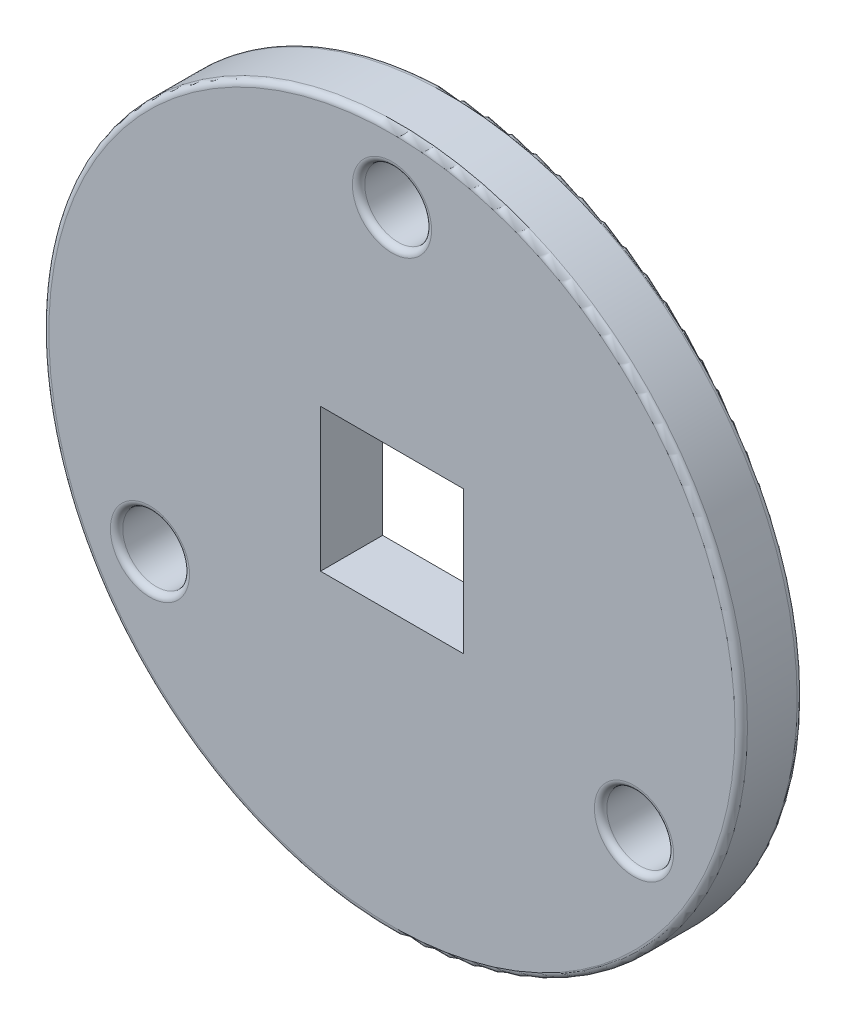
ISO-10303-21;
HEADER;
FILE_DESCRIPTION(('STEP AP214'),'2;1');
FILE_NAME('part.step','',(''),(''),'','','');
FILE_SCHEMA(('AUTOMOTIVE_DESIGN { 1 0 10303 214 1 1 1 1 }'));
ENDSEC;
DATA;
#1=APPLICATION_CONTEXT('core data for automotive mechanical design processes');
#2=APPLICATION_PROTOCOL_DEFINITION('international standard','automotive_design',2000,#1);
#3=PRODUCT_CONTEXT('',#1,'mechanical');
#4=PRODUCT('Part','Part','',(#3));
#5=PRODUCT_RELATED_PRODUCT_CATEGORY('part','',(#4));
#6=PRODUCT_DEFINITION_FORMATION('','',#4);
#7=PRODUCT_DEFINITION_CONTEXT('part definition',#1,'design');
#8=PRODUCT_DEFINITION('design','',#6,#7);
#9=PRODUCT_DEFINITION_SHAPE('','',#8);
#10=(LENGTH_UNIT() NAMED_UNIT(*) SI_UNIT(.MILLI.,.METRE.));
#11=(NAMED_UNIT(*) PLANE_ANGLE_UNIT() SI_UNIT($,.RADIAN.));
#12=(NAMED_UNIT(*) SI_UNIT($,.STERADIAN.) SOLID_ANGLE_UNIT());
#13=UNCERTAINTY_MEASURE_WITH_UNIT(LENGTH_MEASURE(1.E-05),#10,'distance_accuracy_value','');
#14=(GEOMETRIC_REPRESENTATION_CONTEXT(3) GLOBAL_UNCERTAINTY_ASSIGNED_CONTEXT((#13)) GLOBAL_UNIT_ASSIGNED_CONTEXT((#10,
#11,#12)) REPRESENTATION_CONTEXT('',''));
#15=CARTESIAN_POINT('',(0.,0.,0.));
#16=DIRECTION('',(0.,0.,1.));
#17=DIRECTION('',(1.,0.,0.));
#18=AXIS2_PLACEMENT_3D('',#15,#16,#17);
#19=CARTESIAN_POINT('',(0.,0.,20.));
#20=DIRECTION('',(0.,0.,1.));
#21=DIRECTION('',(1.,0.,0.));
#22=AXIS2_PLACEMENT_3D('',#19,#20,#21);
#23=PLANE('',#22);
#24=CARTESIAN_POINT('',(0.,0.,20.));
#25=DIRECTION('',(0.,0.,1.));
#26=DIRECTION('',(1.,0.,0.));
#27=AXIS2_PLACEMENT_3D('',#24,#25,#26);
#28=CIRCLE('',#27,110.5);
#29=CARTESIAN_POINT('',(110.5,0.,20.));
#30=VERTEX_POINT('',#29);
#31=EDGE_CURVE('E156',#30,#30,#28,.T.);
#32=ORIENTED_EDGE('',*,*,#31,.T.);
#33=EDGE_LOOP('',(#32));
#34=FACE_BOUND('',#33,.T.);
#35=CARTESIAN_POINT('',(-77.9422863405995,-45.,20.));
#36=DIRECTION('',(0.,0.,1.));
#37=DIRECTION('',(1.,0.,0.));
#38=AXIS2_PLACEMENT_3D('',#35,#36,#37);
#39=CIRCLE('',#38,12.75);
#40=CARTESIAN_POINT('',(-65.1922863405995,-45.,20.));
#41=VERTEX_POINT('',#40);
#42=EDGE_CURVE('E153',#41,#41,#39,.F.);
#43=ORIENTED_EDGE('',*,*,#42,.T.);
#44=EDGE_LOOP('',(#43));
#45=FACE_BOUND('',#44,.T.);
#46=CARTESIAN_POINT('',(0.,90.,20.));
#47=DIRECTION('',(0.,0.,1.));
#48=DIRECTION('',(1.,0.,0.));
#49=AXIS2_PLACEMENT_3D('',#46,#47,#48);
#50=CIRCLE('',#49,12.75);
#51=CARTESIAN_POINT('',(12.75,90.,20.));
#52=VERTEX_POINT('',#51);
#53=EDGE_CURVE('E150',#52,#52,#50,.F.);
#54=ORIENTED_EDGE('',*,*,#53,.T.);
#55=EDGE_LOOP('',(#54));
#56=FACE_BOUND('',#55,.T.);
#57=CARTESIAN_POINT('',(77.9422863405995,-45.,20.));
#58=DIRECTION('',(0.,0.,1.));
#59=DIRECTION('',(1.,0.,0.));
#60=AXIS2_PLACEMENT_3D('',#57,#58,#59);
#61=CIRCLE('',#60,12.75);
#62=CARTESIAN_POINT('',(90.6922863405995,-45.,20.));
#63=VERTEX_POINT('',#62);
#64=EDGE_CURVE('E147',#63,#63,#61,.F.);
#65=ORIENTED_EDGE('',*,*,#64,.T.);
#66=EDGE_LOOP('',(#65));
#67=FACE_BOUND('',#66,.T.);
#68=DIRECTION('',(1.,0.,0.));
#69=VECTOR('',#68,1.);
#70=CARTESIAN_POINT('',(-23.,-23.,20.));
#71=LINE('',#70,#69);
#72=CARTESIAN_POINT('',(-23.,-23.,20.));
#73=VERTEX_POINT('',#72);
#74=CARTESIAN_POINT('',(23.,-23.,20.));
#75=VERTEX_POINT('',#74);
#76=EDGE_CURVE('E102',#73,#75,#71,.T.);
#77=ORIENTED_EDGE('',*,*,#76,.F.);
#78=DIRECTION('',(0.,-1.,0.));
#79=VECTOR('',#78,1.);
#80=CARTESIAN_POINT('',(-23.,23.,20.));
#81=LINE('',#80,#79);
#82=CARTESIAN_POINT('',(-23.,23.,20.));
#83=VERTEX_POINT('',#82);
#84=EDGE_CURVE('E94',#83,#73,#81,.T.);
#85=ORIENTED_EDGE('',*,*,#84,.F.);
#86=DIRECTION('',(-1.,0.,0.));
#87=VECTOR('',#86,1.);
#88=CARTESIAN_POINT('',(-23.,23.,20.));
#89=LINE('',#88,#87);
#90=CARTESIAN_POINT('',(23.,23.,20.));
#91=VERTEX_POINT('',#90);
#92=EDGE_CURVE('E116',#91,#83,#89,.T.);
#93=ORIENTED_EDGE('',*,*,#92,.F.);
#94=DIRECTION('',(0.,1.,0.));
#95=VECTOR('',#94,1.);
#96=CARTESIAN_POINT('',(23.,23.,20.));
#97=LINE('',#96,#95);
#98=EDGE_CURVE('E114',#75,#91,#97,.T.);
#99=ORIENTED_EDGE('',*,*,#98,.F.);
#100=EDGE_LOOP('',(#77,#85,#93,#99));
#101=FACE_BOUND('',#100,.T.);
#102=ADVANCED_FACE('F53',(#34,#45,#56,#67,#101),#23,.T.);
#103=CARTESIAN_POINT('',(0.,0.,0.));
#104=DIRECTION('',(0.,0.,1.));
#105=DIRECTION('',(1.,0.,0.));
#106=AXIS2_PLACEMENT_3D('',#103,#104,#105);
#107=PLANE('',#106);
#108=CARTESIAN_POINT('',(0.,0.,0.));
#109=DIRECTION('',(0.,0.,1.));
#110=DIRECTION('',(1.,0.,0.));
#111=AXIS2_PLACEMENT_3D('',#108,#109,#110);
#112=CIRCLE('',#111,110.5);
#113=CARTESIAN_POINT('',(110.5,0.,0.));
#114=VERTEX_POINT('',#113);
#115=EDGE_CURVE('E144',#114,#114,#112,.F.);
#116=ORIENTED_EDGE('',*,*,#115,.T.);
#117=EDGE_LOOP('',(#116));
#118=FACE_BOUND('',#117,.T.);
#119=CARTESIAN_POINT('',(77.9422863405995,-45.,0.));
#120=DIRECTION('',(0.,0.,1.));
#121=DIRECTION('',(1.,0.,0.));
#122=AXIS2_PLACEMENT_3D('',#119,#120,#121);
#123=CIRCLE('',#122,12.75);
#124=CARTESIAN_POINT('',(90.6922863405995,-45.,0.));
#125=VERTEX_POINT('',#124);
#126=EDGE_CURVE('E141',#125,#125,#123,.T.);
#127=ORIENTED_EDGE('',*,*,#126,.T.);
#128=EDGE_LOOP('',(#127));
#129=FACE_BOUND('',#128,.T.);
#130=CARTESIAN_POINT('',(0.,90.,0.));
#131=DIRECTION('',(0.,0.,1.));
#132=DIRECTION('',(1.,0.,0.));
#133=AXIS2_PLACEMENT_3D('',#130,#131,#132);
#134=CIRCLE('',#133,12.75);
#135=CARTESIAN_POINT('',(12.75,90.,0.));
#136=VERTEX_POINT('',#135);
#137=EDGE_CURVE('E138',#136,#136,#134,.T.);
#138=ORIENTED_EDGE('',*,*,#137,.T.);
#139=EDGE_LOOP('',(#138));
#140=FACE_BOUND('',#139,.T.);
#141=CARTESIAN_POINT('',(-77.9422863405995,-45.,0.));
#142=DIRECTION('',(0.,0.,1.));
#143=DIRECTION('',(1.,0.,0.));
#144=AXIS2_PLACEMENT_3D('',#141,#142,#143);
#145=CIRCLE('',#144,12.75);
#146=CARTESIAN_POINT('',(-65.1922863405995,-45.,0.));
#147=VERTEX_POINT('',#146);
#148=EDGE_CURVE('E135',#147,#147,#145,.T.);
#149=ORIENTED_EDGE('',*,*,#148,.T.);
#150=EDGE_LOOP('',(#149));
#151=FACE_BOUND('',#150,.T.);
#152=DIRECTION('',(0.,-1.,0.));
#153=VECTOR('',#152,1.);
#154=CARTESIAN_POINT('',(-23.,23.,0.));
#155=LINE('',#154,#153);
#156=CARTESIAN_POINT('',(-23.,23.,0.));
#157=VERTEX_POINT('',#156);
#158=CARTESIAN_POINT('',(-23.,-23.,0.));
#159=VERTEX_POINT('',#158);
#160=EDGE_CURVE('E76',#157,#159,#155,.T.);
#161=ORIENTED_EDGE('',*,*,#160,.T.);
#162=DIRECTION('',(1.,0.,0.));
#163=VECTOR('',#162,1.);
#164=CARTESIAN_POINT('',(-23.,-23.,0.));
#165=LINE('',#164,#163);
#166=CARTESIAN_POINT('',(23.,-23.,0.));
#167=VERTEX_POINT('',#166);
#168=EDGE_CURVE('E109',#159,#167,#165,.T.);
#169=ORIENTED_EDGE('',*,*,#168,.T.);
#170=DIRECTION('',(0.,1.,0.));
#171=VECTOR('',#170,1.);
#172=CARTESIAN_POINT('',(23.,23.,0.));
#173=LINE('',#172,#171);
#174=CARTESIAN_POINT('',(23.,23.,0.));
#175=VERTEX_POINT('',#174);
#176=EDGE_CURVE('E122',#167,#175,#173,.T.);
#177=ORIENTED_EDGE('',*,*,#176,.T.);
#178=DIRECTION('',(-1.,0.,0.));
#179=VECTOR('',#178,1.);
#180=CARTESIAN_POINT('',(-23.,23.,0.));
#181=LINE('',#180,#179);
#182=EDGE_CURVE('E103',#175,#157,#181,.T.);
#183=ORIENTED_EDGE('',*,*,#182,.T.);
#184=EDGE_LOOP('',(#161,#169,#177,#183));
#185=FACE_BOUND('',#184,.T.);
#186=ADVANCED_FACE('F191',(#118,#129,#140,#151,#185),#107,.F.);
#187=CARTESIAN_POINT('',(0.,0.,20.));
#188=DIRECTION('',(0.,0.,-1.));
#189=DIRECTION('',(-1.,0.,0.));
#190=AXIS2_PLACEMENT_3D('',#187,#188,#189);
#191=CYLINDRICAL_SURFACE('',#190,112.5);
#192=CARTESIAN_POINT('',(0.,0.,2.));
#193=DIRECTION('',(0.,0.,1.));
#194=DIRECTION('',(1.,0.,0.));
#195=AXIS2_PLACEMENT_3D('',#192,#193,#194);
#196=CIRCLE('',#195,112.5);
#197=CARTESIAN_POINT('',(112.5,0.,2.));
#198=VERTEX_POINT('',#197);
#199=EDGE_CURVE('E132',#198,#198,#196,.T.);
#200=ORIENTED_EDGE('',*,*,#199,.T.);
#201=EDGE_LOOP('',(#200));
#202=FACE_BOUND('',#201,.T.);
#203=CARTESIAN_POINT('',(0.,0.,18.));
#204=DIRECTION('',(0.,0.,1.));
#205=DIRECTION('',(1.,0.,0.));
#206=AXIS2_PLACEMENT_3D('',#203,#204,#205);
#207=CIRCLE('',#206,112.5);
#208=CARTESIAN_POINT('',(112.5,0.,18.));
#209=VERTEX_POINT('',#208);
#210=EDGE_CURVE('E110',#209,#209,#207,.F.);
#211=ORIENTED_EDGE('',*,*,#210,.T.);
#212=EDGE_LOOP('',(#211));
#213=FACE_BOUND('',#212,.T.);
#214=ADVANCED_FACE('F198',(#202,#213),#191,.T.);
#215=CARTESIAN_POINT('',(-23.,23.,20.));
#216=DIRECTION('',(1.,0.,0.));
#217=DIRECTION('',(0.,0.,-1.));
#218=AXIS2_PLACEMENT_3D('',#215,#216,#217);
#219=PLANE('',#218);
#220=ORIENTED_EDGE('',*,*,#160,.F.);
#221=DIRECTION('',(0.,0.,-1.));
#222=VECTOR('',#221,1.);
#223=CARTESIAN_POINT('',(-23.,23.,20.));
#224=LINE('',#223,#222);
#225=EDGE_CURVE('E98',#83,#157,#224,.T.);
#226=ORIENTED_EDGE('',*,*,#225,.F.);
#227=ORIENTED_EDGE('',*,*,#84,.T.);
#228=DIRECTION('',(0.,0.,-1.));
#229=VECTOR('',#228,1.);
#230=CARTESIAN_POINT('',(-23.,-23.,20.));
#231=LINE('',#230,#229);
#232=EDGE_CURVE('E97',#73,#159,#231,.T.);
#233=ORIENTED_EDGE('',*,*,#232,.T.);
#234=EDGE_LOOP('',(#220,#226,#227,#233));
#235=FACE_BOUND('',#234,.T.);
#236=ADVANCED_FACE('F96',(#235),#219,.T.);
#237=CARTESIAN_POINT('',(-23.,-23.,20.));
#238=DIRECTION('',(0.,1.,0.));
#239=DIRECTION('',(0.,0.,1.));
#240=AXIS2_PLACEMENT_3D('',#237,#238,#239);
#241=PLANE('',#240);
#242=ORIENTED_EDGE('',*,*,#168,.F.);
#243=ORIENTED_EDGE('',*,*,#232,.F.);
#244=ORIENTED_EDGE('',*,*,#76,.T.);
#245=DIRECTION('',(0.,0.,-1.));
#246=VECTOR('',#245,1.);
#247=CARTESIAN_POINT('',(23.,-23.,20.));
#248=LINE('',#247,#246);
#249=EDGE_CURVE('E111',#75,#167,#248,.T.);
#250=ORIENTED_EDGE('',*,*,#249,.T.);
#251=EDGE_LOOP('',(#242,#243,#244,#250));
#252=FACE_BOUND('',#251,.T.);
#253=ADVANCED_FACE('F106',(#252),#241,.T.);
#254=CARTESIAN_POINT('',(23.,23.,20.));
#255=DIRECTION('',(-1.,0.,0.));
#256=DIRECTION('',(0.,0.,1.));
#257=AXIS2_PLACEMENT_3D('',#254,#255,#256);
#258=PLANE('',#257);
#259=ORIENTED_EDGE('',*,*,#176,.F.);
#260=ORIENTED_EDGE('',*,*,#249,.F.);
#261=ORIENTED_EDGE('',*,*,#98,.T.);
#262=DIRECTION('',(0.,0.,-1.));
#263=VECTOR('',#262,1.);
#264=CARTESIAN_POINT('',(23.,23.,20.));
#265=LINE('',#264,#263);
#266=EDGE_CURVE('E68',#91,#175,#265,.T.);
#267=ORIENTED_EDGE('',*,*,#266,.T.);
#268=EDGE_LOOP('',(#259,#260,#261,#267));
#269=FACE_BOUND('',#268,.T.);
#270=ADVANCED_FACE('F234',(#269),#258,.T.);
#271=CARTESIAN_POINT('',(-23.,23.,20.));
#272=DIRECTION('',(0.,-1.,0.));
#273=DIRECTION('',(0.,0.,-1.));
#274=AXIS2_PLACEMENT_3D('',#271,#272,#273);
#275=PLANE('',#274);
#276=ORIENTED_EDGE('',*,*,#182,.F.);
#277=ORIENTED_EDGE('',*,*,#266,.F.);
#278=ORIENTED_EDGE('',*,*,#92,.T.);
#279=ORIENTED_EDGE('',*,*,#225,.T.);
#280=EDGE_LOOP('',(#276,#277,#278,#279));
#281=FACE_BOUND('',#280,.T.);
#282=ADVANCED_FACE('F232',(#281),#275,.T.);
#283=CARTESIAN_POINT('',(0.,90.,20.));
#284=DIRECTION('',(0.,0.,-1.));
#285=DIRECTION('',(-1.,0.,0.));
#286=AXIS2_PLACEMENT_3D('',#283,#284,#285);
#287=CYLINDRICAL_SURFACE('',#286,10.75);
#288=CARTESIAN_POINT('',(0.,90.,2.));
#289=DIRECTION('',(0.,0.,1.));
#290=DIRECTION('',(1.,0.,0.));
#291=AXIS2_PLACEMENT_3D('',#288,#289,#290);
#292=CIRCLE('',#291,10.75);
#293=CARTESIAN_POINT('',(10.75,90.,2.));
#294=VERTEX_POINT('',#293);
#295=EDGE_CURVE('E168',#294,#294,#292,.F.);
#296=ORIENTED_EDGE('',*,*,#295,.T.);
#297=EDGE_LOOP('',(#296));
#298=FACE_BOUND('',#297,.T.);
#299=CARTESIAN_POINT('',(0.,90.,18.));
#300=DIRECTION('',(0.,0.,1.));
#301=DIRECTION('',(1.,0.,0.));
#302=AXIS2_PLACEMENT_3D('',#299,#300,#301);
#303=CIRCLE('',#302,10.75);
#304=CARTESIAN_POINT('',(10.75,90.,18.));
#305=VERTEX_POINT('',#304);
#306=EDGE_CURVE('E165',#305,#305,#303,.T.);
#307=ORIENTED_EDGE('',*,*,#306,.T.);
#308=EDGE_LOOP('',(#307));
#309=FACE_BOUND('',#308,.T.);
#310=ADVANCED_FACE('F233',(#298,#309),#287,.F.);
#311=CARTESIAN_POINT('',(77.9422863405995,-45.,20.));
#312=DIRECTION('',(0.,0.,-1.));
#313=DIRECTION('',(-1.,0.,0.));
#314=AXIS2_PLACEMENT_3D('',#311,#312,#313);
#315=CYLINDRICAL_SURFACE('',#314,10.75);
#316=CARTESIAN_POINT('',(77.9422863405995,-45.,2.));
#317=DIRECTION('',(0.,0.,1.));
#318=DIRECTION('',(1.,0.,0.));
#319=AXIS2_PLACEMENT_3D('',#316,#317,#318);
#320=CIRCLE('',#319,10.75);
#321=CARTESIAN_POINT('',(88.6922863405995,-45.,2.));
#322=VERTEX_POINT('',#321);
#323=EDGE_CURVE('E162',#322,#322,#320,.F.);
#324=ORIENTED_EDGE('',*,*,#323,.T.);
#325=EDGE_LOOP('',(#324));
#326=FACE_BOUND('',#325,.T.);
#327=CARTESIAN_POINT('',(77.9422863405995,-45.,18.));
#328=DIRECTION('',(0.,0.,1.));
#329=DIRECTION('',(1.,0.,0.));
#330=AXIS2_PLACEMENT_3D('',#327,#328,#329);
#331=CIRCLE('',#330,10.75);
#332=CARTESIAN_POINT('',(88.6922863405995,-45.,18.));
#333=VERTEX_POINT('',#332);
#334=EDGE_CURVE('E159',#333,#333,#331,.T.);
#335=ORIENTED_EDGE('',*,*,#334,.T.);
#336=EDGE_LOOP('',(#335));
#337=FACE_BOUND('',#336,.T.);
#338=ADVANCED_FACE('F240',(#326,#337),#315,.F.);
#339=CARTESIAN_POINT('',(-77.9422863405995,-45.,20.));
#340=DIRECTION('',(0.,0.,-1.));
#341=DIRECTION('',(-1.,0.,0.));
#342=AXIS2_PLACEMENT_3D('',#339,#340,#341);
#343=CYLINDRICAL_SURFACE('',#342,10.75);
#344=CARTESIAN_POINT('',(-77.9422863405995,-45.,2.));
#345=DIRECTION('',(0.,0.,1.));
#346=DIRECTION('',(1.,0.,0.));
#347=AXIS2_PLACEMENT_3D('',#344,#345,#346);
#348=CIRCLE('',#347,10.75);
#349=CARTESIAN_POINT('',(-67.1922863405995,-45.,2.));
#350=VERTEX_POINT('',#349);
#351=EDGE_CURVE('E13',#350,#350,#348,.F.);
#352=ORIENTED_EDGE('',*,*,#351,.T.);
#353=EDGE_LOOP('',(#352));
#354=FACE_BOUND('',#353,.T.);
#355=CARTESIAN_POINT('',(-77.9422863405995,-45.,18.));
#356=DIRECTION('',(0.,0.,1.));
#357=DIRECTION('',(1.,0.,0.));
#358=AXIS2_PLACEMENT_3D('',#355,#356,#357);
#359=CIRCLE('',#358,10.75);
#360=CARTESIAN_POINT('',(-67.1922863405995,-45.,18.));
#361=VERTEX_POINT('',#360);
#362=EDGE_CURVE('E61',#361,#361,#359,.T.);
#363=ORIENTED_EDGE('',*,*,#362,.T.);
#364=EDGE_LOOP('',(#363));
#365=FACE_BOUND('',#364,.T.);
#366=ADVANCED_FACE('F173',(#354,#365),#343,.F.);
#367=CARTESIAN_POINT('',(0.,0.,2.));
#368=DIRECTION('',(0.,0.,1.));
#369=DIRECTION('',(1.,0.,0.));
#370=AXIS2_PLACEMENT_3D('',#367,#368,#369);
#371=TOROIDAL_SURFACE('',#370,110.5,2.);
#372=ORIENTED_EDGE('',*,*,#115,.F.);
#373=EDGE_LOOP('',(#372));
#374=FACE_BOUND('',#373,.T.);
#375=ORIENTED_EDGE('',*,*,#199,.F.);
#376=EDGE_LOOP('',(#375));
#377=FACE_BOUND('',#376,.T.);
#378=ADVANCED_FACE('F208',(#374,#377),#371,.T.);
#379=CARTESIAN_POINT('',(0.,0.,18.));
#380=DIRECTION('',(0.,0.,1.));
#381=DIRECTION('',(1.,0.,0.));
#382=AXIS2_PLACEMENT_3D('',#379,#380,#381);
#383=TOROIDAL_SURFACE('',#382,110.5,2.);
#384=ORIENTED_EDGE('',*,*,#210,.F.);
#385=EDGE_LOOP('',(#384));
#386=FACE_BOUND('',#385,.T.);
#387=ORIENTED_EDGE('',*,*,#31,.F.);
#388=EDGE_LOOP('',(#387));
#389=FACE_BOUND('',#388,.T.);
#390=ADVANCED_FACE('F211',(#386,#389),#383,.T.);
#391=CARTESIAN_POINT('',(77.9422863405995,-45.,2.));
#392=DIRECTION('',(0.,0.,1.));
#393=DIRECTION('',(1.,0.,0.));
#394=AXIS2_PLACEMENT_3D('',#391,#392,#393);
#395=TOROIDAL_SURFACE('',#394,12.75,2.);
#396=ORIENTED_EDGE('',*,*,#323,.F.);
#397=EDGE_LOOP('',(#396));
#398=FACE_BOUND('',#397,.T.);
#399=ORIENTED_EDGE('',*,*,#126,.F.);
#400=EDGE_LOOP('',(#399));
#401=FACE_BOUND('',#400,.T.);
#402=ADVANCED_FACE('F215',(#398,#401),#395,.T.);
#403=CARTESIAN_POINT('',(0.,90.,2.));
#404=DIRECTION('',(0.,0.,1.));
#405=DIRECTION('',(1.,0.,0.));
#406=AXIS2_PLACEMENT_3D('',#403,#404,#405);
#407=TOROIDAL_SURFACE('',#406,12.75,2.);
#408=ORIENTED_EDGE('',*,*,#295,.F.);
#409=EDGE_LOOP('',(#408));
#410=FACE_BOUND('',#409,.T.);
#411=ORIENTED_EDGE('',*,*,#137,.F.);
#412=EDGE_LOOP('',(#411));
#413=FACE_BOUND('',#412,.T.);
#414=ADVANCED_FACE('F186',(#410,#413),#407,.T.);
#415=CARTESIAN_POINT('',(-77.9422863405995,-45.,2.));
#416=DIRECTION('',(0.,0.,1.));
#417=DIRECTION('',(1.,0.,0.));
#418=AXIS2_PLACEMENT_3D('',#415,#416,#417);
#419=TOROIDAL_SURFACE('',#418,12.75,2.);
#420=ORIENTED_EDGE('',*,*,#351,.F.);
#421=EDGE_LOOP('',(#420));
#422=FACE_BOUND('',#421,.T.);
#423=ORIENTED_EDGE('',*,*,#148,.F.);
#424=EDGE_LOOP('',(#423));
#425=FACE_BOUND('',#424,.T.);
#426=ADVANCED_FACE('F178',(#422,#425),#419,.T.);
#427=CARTESIAN_POINT('',(-77.9422863405995,-45.,18.));
#428=DIRECTION('',(0.,0.,1.));
#429=DIRECTION('',(1.,0.,0.));
#430=AXIS2_PLACEMENT_3D('',#427,#428,#429);
#431=TOROIDAL_SURFACE('',#430,12.75,2.);
#432=ORIENTED_EDGE('',*,*,#42,.F.);
#433=EDGE_LOOP('',(#432));
#434=FACE_BOUND('',#433,.T.);
#435=ORIENTED_EDGE('',*,*,#362,.F.);
#436=EDGE_LOOP('',(#435));
#437=FACE_BOUND('',#436,.T.);
#438=ADVANCED_FACE('F175',(#434,#437),#431,.T.);
#439=CARTESIAN_POINT('',(0.,90.,18.));
#440=DIRECTION('',(0.,0.,1.));
#441=DIRECTION('',(1.,0.,0.));
#442=AXIS2_PLACEMENT_3D('',#439,#440,#441);
#443=TOROIDAL_SURFACE('',#442,12.75,2.);
#444=ORIENTED_EDGE('',*,*,#53,.F.);
#445=EDGE_LOOP('',(#444));
#446=FACE_BOUND('',#445,.T.);
#447=ORIENTED_EDGE('',*,*,#306,.F.);
#448=EDGE_LOOP('',(#447));
#449=FACE_BOUND('',#448,.T.);
#450=ADVANCED_FACE('F177',(#446,#449),#443,.T.);
#451=CARTESIAN_POINT('',(77.9422863405995,-45.,18.));
#452=DIRECTION('',(0.,0.,1.));
#453=DIRECTION('',(1.,0.,0.));
#454=AXIS2_PLACEMENT_3D('',#451,#452,#453);
#455=TOROIDAL_SURFACE('',#454,12.75,2.);
#456=ORIENTED_EDGE('',*,*,#64,.F.);
#457=EDGE_LOOP('',(#456));
#458=FACE_BOUND('',#457,.T.);
#459=ORIENTED_EDGE('',*,*,#334,.F.);
#460=EDGE_LOOP('',(#459));
#461=FACE_BOUND('',#460,.T.);
#462=ADVANCED_FACE('F55',(#458,#461),#455,.T.);
#463=CLOSED_SHELL('',(#102,#186,#214,#236,#253,#270,#282,#310,#338,#366,#378,#390,#402,#414,
#426,#438,#450,#462));
#464=MANIFOLD_SOLID_BREP('B2',#463);
#465=ADVANCED_BREP_SHAPE_REPRESENTATION('',(#18,#464),#14);
#466=SHAPE_DEFINITION_REPRESENTATION(#9,#465);
ENDSEC;
END-ISO-10303-21;
